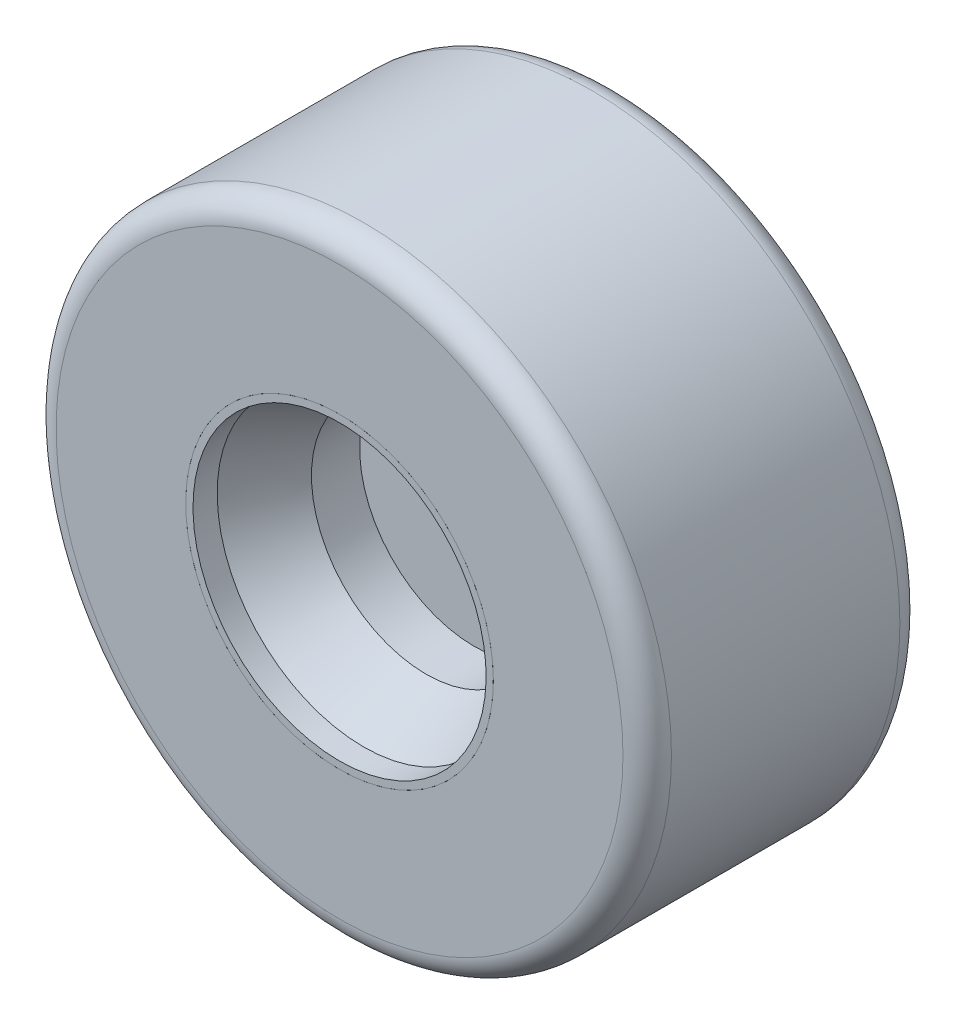
ISO-10303-21;
HEADER;
FILE_DESCRIPTION(('STEP AP214'),'2;1');
FILE_NAME('part.step','',(''),(''),'','','');
FILE_SCHEMA(('AUTOMOTIVE_DESIGN { 1 0 10303 214 1 1 1 1 }'));
ENDSEC;
DATA;
#1=APPLICATION_CONTEXT('core data for automotive mechanical design processes');
#2=APPLICATION_PROTOCOL_DEFINITION('international standard','automotive_design',2000,#1);
#3=PRODUCT_CONTEXT('',#1,'mechanical');
#4=PRODUCT('Part','Part','',(#3));
#5=PRODUCT_RELATED_PRODUCT_CATEGORY('part','',(#4));
#6=PRODUCT_DEFINITION_FORMATION('','',#4);
#7=PRODUCT_DEFINITION_CONTEXT('part definition',#1,'design');
#8=PRODUCT_DEFINITION('design','',#6,#7);
#9=PRODUCT_DEFINITION_SHAPE('','',#8);
#10=(LENGTH_UNIT() NAMED_UNIT(*) SI_UNIT(.MILLI.,.METRE.));
#11=(NAMED_UNIT(*) PLANE_ANGLE_UNIT() SI_UNIT($,.RADIAN.));
#12=(NAMED_UNIT(*) SI_UNIT($,.STERADIAN.) SOLID_ANGLE_UNIT());
#13=UNCERTAINTY_MEASURE_WITH_UNIT(LENGTH_MEASURE(1.E-05),#10,'distance_accuracy_value','');
#14=(GEOMETRIC_REPRESENTATION_CONTEXT(3) GLOBAL_UNCERTAINTY_ASSIGNED_CONTEXT((#13)) GLOBAL_UNIT_ASSIGNED_CONTEXT((#10,
#11,#12)) REPRESENTATION_CONTEXT('',''));
#15=CARTESIAN_POINT('',(0.,0.,0.));
#16=DIRECTION('',(0.,0.,1.));
#17=DIRECTION('',(1.,0.,0.));
#18=AXIS2_PLACEMENT_3D('',#15,#16,#17);
#19=CARTESIAN_POINT('',(0.,-45.7524474544663,-47.15));
#20=DIRECTION('',(0.,0.,1.));
#21=DIRECTION('',(1.,0.,0.));
#22=AXIS2_PLACEMENT_3D('',#19,#20,#21);
#23=TOROIDAL_SURFACE('',#22,117.,10.);
#24=CARTESIAN_POINT('',(0.,-45.7524474544663,-47.1499999999999));
#25=DIRECTION('',(0.,0.,1.));
#26=DIRECTION('',(1.,0.,0.));
#27=AXIS2_PLACEMENT_3D('',#24,#25,#26);
#28=CIRCLE('',#27,127.);
#29=CARTESIAN_POINT('',(127.,-45.7524474544663,-47.1499999999999));
#30=VERTEX_POINT('',#29);
#31=EDGE_CURVE('E12',#30,#30,#28,.T.);
#32=ORIENTED_EDGE('',*,*,#31,.F.);
#33=EDGE_LOOP('',(#32));
#34=FACE_BOUND('',#33,.T.);
#35=CARTESIAN_POINT('',(0.,-45.7524474544663,-57.1499999999999));
#36=DIRECTION('',(0.,0.,1.));
#37=DIRECTION('',(1.,0.,0.));
#38=AXIS2_PLACEMENT_3D('',#35,#36,#37);
#39=CIRCLE('',#38,117.);
#40=CARTESIAN_POINT('',(117.,-45.7524474544663,-57.1499999999999));
#41=VERTEX_POINT('',#40);
#42=EDGE_CURVE('E90',#41,#41,#39,.T.);
#43=ORIENTED_EDGE('',*,*,#42,.T.);
#44=EDGE_LOOP('',(#43));
#45=FACE_BOUND('',#44,.T.);
#46=ADVANCED_FACE('F55',(#34,#45),#23,.T.);
#47=CARTESIAN_POINT('',(0.,-45.7524474544663,166.091754176168));
#48=DIRECTION('',(0.,0.,1.));
#49=DIRECTION('',(1.,0.,0.));
#50=AXIS2_PLACEMENT_3D('',#47,#48,#49);
#51=CYLINDRICAL_SURFACE('',#50,127.);
#52=CARTESIAN_POINT('',(0.,-45.7524474544663,47.1499999999999));
#53=DIRECTION('',(0.,0.,1.));
#54=DIRECTION('',(1.,0.,0.));
#55=AXIS2_PLACEMENT_3D('',#52,#53,#54);
#56=CIRCLE('',#55,127.);
#57=CARTESIAN_POINT('',(127.,-45.7524474544663,47.1499999999999));
#58=VERTEX_POINT('',#57);
#59=EDGE_CURVE('E62',#58,#58,#56,.T.);
#60=ORIENTED_EDGE('',*,*,#59,.F.);
#61=EDGE_LOOP('',(#60));
#62=FACE_BOUND('',#61,.T.);
#63=ORIENTED_EDGE('',*,*,#31,.T.);
#64=EDGE_LOOP('',(#63));
#65=FACE_BOUND('',#64,.T.);
#66=ADVANCED_FACE('F180',(#62,#65),#51,.T.);
#67=CARTESIAN_POINT('',(0.,-45.7524474544663,47.15));
#68=DIRECTION('',(0.,0.,1.));
#69=DIRECTION('',(1.,0.,0.));
#70=AXIS2_PLACEMENT_3D('',#67,#68,#69);
#71=TOROIDAL_SURFACE('',#70,117.,9.99999999999999);
#72=CARTESIAN_POINT('',(0.,-45.7524474544663,57.15));
#73=DIRECTION('',(0.,0.,1.));
#74=DIRECTION('',(1.,0.,0.));
#75=AXIS2_PLACEMENT_3D('',#72,#73,#74);
#76=CIRCLE('',#75,117.);
#77=CARTESIAN_POINT('',(117.,-45.7524474544663,57.15));
#78=VERTEX_POINT('',#77);
#79=EDGE_CURVE('E66',#78,#78,#76,.T.);
#80=ORIENTED_EDGE('',*,*,#79,.F.);
#81=EDGE_LOOP('',(#80));
#82=FACE_BOUND('',#81,.T.);
#83=ORIENTED_EDGE('',*,*,#59,.T.);
#84=EDGE_LOOP('',(#83));
#85=FACE_BOUND('',#84,.T.);
#86=ADVANCED_FACE('F177',(#82,#85),#71,.T.);
#87=CARTESIAN_POINT('',(0.,17.7475525455337,57.15));
#88=DIRECTION('',(0.,0.,-1.));
#89=DIRECTION('',(-1.,0.,0.));
#90=AXIS2_PLACEMENT_3D('',#87,#88,#89);
#91=PLANE('',#90);
#92=CARTESIAN_POINT('',(0.,-45.7524474544663,57.15));
#93=DIRECTION('',(0.,0.,1.));
#94=DIRECTION('',(1.,0.,0.));
#95=AXIS2_PLACEMENT_3D('',#92,#93,#94);
#96=CIRCLE('',#95,63.5);
#97=CARTESIAN_POINT('',(63.5,-45.7524474544663,57.15));
#98=VERTEX_POINT('',#97);
#99=EDGE_CURVE('E70',#98,#98,#96,.T.);
#100=ORIENTED_EDGE('',*,*,#99,.F.);
#101=EDGE_LOOP('',(#100));
#102=FACE_BOUND('',#101,.T.);
#103=ORIENTED_EDGE('',*,*,#79,.T.);
#104=EDGE_LOOP('',(#103));
#105=FACE_BOUND('',#104,.T.);
#106=ADVANCED_FACE('F173',(#102,#105),#91,.F.);
#107=CARTESIAN_POINT('',(0.,-45.7524474544663,166.091754176168));
#108=DIRECTION('',(0.,0.,1.));
#109=DIRECTION('',(1.,0.,0.));
#110=AXIS2_PLACEMENT_3D('',#107,#108,#109);
#111=CYLINDRICAL_SURFACE('',#110,63.5);
#112=CARTESIAN_POINT('',(0.,-45.7524474544663,47.15));
#113=DIRECTION('',(0.,0.,1.));
#114=DIRECTION('',(1.,0.,0.));
#115=AXIS2_PLACEMENT_3D('',#112,#113,#114);
#116=CIRCLE('',#115,63.5);
#117=CARTESIAN_POINT('',(63.5,-45.7524474544663,47.15));
#118=VERTEX_POINT('',#117);
#119=EDGE_CURVE('E75',#118,#118,#116,.T.);
#120=ORIENTED_EDGE('',*,*,#119,.F.);
#121=EDGE_LOOP('',(#120));
#122=FACE_BOUND('',#121,.T.);
#123=ORIENTED_EDGE('',*,*,#99,.T.);
#124=EDGE_LOOP('',(#123));
#125=FACE_BOUND('',#124,.T.);
#126=ADVANCED_FACE('F169',(#122,#125),#111,.F.);
#127=CARTESIAN_POINT('',(0.,-45.7524474544663,47.15));
#128=DIRECTION('',(0.,0.,1.));
#129=DIRECTION('',(1.,0.,0.));
#130=AXIS2_PLACEMENT_3D('',#127,#128,#129);
#131=CONICAL_SURFACE('',#130,63.5,0.47123889803847);
#132=CARTESIAN_POINT('',(0.,-45.7524474544663,21.38));
#133=DIRECTION('',(0.,0.,1.));
#134=DIRECTION('',(1.,0.,0.));
#135=AXIS2_PLACEMENT_3D('',#132,#133,#134);
#136=CIRCLE('',#135,50.3695291665285);
#137=CARTESIAN_POINT('',(50.3695291665285,-45.7524474544663,21.38));
#138=VERTEX_POINT('',#137);
#139=EDGE_CURVE('E78',#138,#138,#136,.T.);
#140=ORIENTED_EDGE('',*,*,#139,.F.);
#141=EDGE_LOOP('',(#140));
#142=FACE_BOUND('',#141,.T.);
#143=ORIENTED_EDGE('',*,*,#119,.T.);
#144=EDGE_LOOP('',(#143));
#145=FACE_BOUND('',#144,.T.);
#146=ADVANCED_FACE('F165',(#142,#145),#131,.F.);
#147=CARTESIAN_POINT('',(0.,-45.7524474544663,166.091754176168));
#148=DIRECTION('',(0.,0.,1.));
#149=DIRECTION('',(1.,0.,0.));
#150=AXIS2_PLACEMENT_3D('',#147,#148,#149);
#151=CYLINDRICAL_SURFACE('',#150,50.3695291665285);
#152=CARTESIAN_POINT('',(0.,-45.7524474544663,-21.38));
#153=DIRECTION('',(0.,0.,1.));
#154=DIRECTION('',(1.,0.,0.));
#155=AXIS2_PLACEMENT_3D('',#152,#153,#154);
#156=CIRCLE('',#155,50.3695291665285);
#157=CARTESIAN_POINT('',(50.3695291665285,-45.7524474544663,-21.38));
#158=VERTEX_POINT('',#157);
#159=EDGE_CURVE('E81',#158,#158,#156,.T.);
#160=ORIENTED_EDGE('',*,*,#159,.F.);
#161=EDGE_LOOP('',(#160));
#162=FACE_BOUND('',#161,.T.);
#163=ORIENTED_EDGE('',*,*,#139,.T.);
#164=EDGE_LOOP('',(#163));
#165=FACE_BOUND('',#164,.T.);
#166=ADVANCED_FACE('F161',(#162,#165),#151,.F.);
#167=CARTESIAN_POINT('',(0.,-45.7524474544663,-21.38));
#168=DIRECTION('',(0.,0.,-1.));
#169=DIRECTION('',(-1.,0.,0.));
#170=AXIS2_PLACEMENT_3D('',#167,#168,#169);
#171=CONICAL_SURFACE('',#170,50.3695291665285,0.47123889803847);
#172=CARTESIAN_POINT('',(0.,-45.7524474544663,-47.15));
#173=DIRECTION('',(0.,0.,1.));
#174=DIRECTION('',(1.,0.,0.));
#175=AXIS2_PLACEMENT_3D('',#172,#173,#174);
#176=CIRCLE('',#175,63.5);
#177=CARTESIAN_POINT('',(63.5,-45.7524474544663,-47.15));
#178=VERTEX_POINT('',#177);
#179=EDGE_CURVE('E84',#178,#178,#176,.T.);
#180=ORIENTED_EDGE('',*,*,#179,.F.);
#181=EDGE_LOOP('',(#180));
#182=FACE_BOUND('',#181,.T.);
#183=ORIENTED_EDGE('',*,*,#159,.T.);
#184=EDGE_LOOP('',(#183));
#185=FACE_BOUND('',#184,.T.);
#186=ADVANCED_FACE('F157',(#182,#185),#171,.F.);
#187=CARTESIAN_POINT('',(0.,-45.7524474544663,166.091754176168));
#188=DIRECTION('',(0.,0.,1.));
#189=DIRECTION('',(1.,0.,0.));
#190=AXIS2_PLACEMENT_3D('',#187,#188,#189);
#191=CYLINDRICAL_SURFACE('',#190,63.5);
#192=CARTESIAN_POINT('',(0.,-45.7524474544663,-57.15));
#193=DIRECTION('',(0.,0.,1.));
#194=DIRECTION('',(1.,0.,0.));
#195=AXIS2_PLACEMENT_3D('',#192,#193,#194);
#196=CIRCLE('',#195,63.5);
#197=CARTESIAN_POINT('',(63.5,-45.7524474544663,-57.15));
#198=VERTEX_POINT('',#197);
#199=EDGE_CURVE('E87',#198,#198,#196,.T.);
#200=ORIENTED_EDGE('',*,*,#199,.F.);
#201=EDGE_LOOP('',(#200));
#202=FACE_BOUND('',#201,.T.);
#203=ORIENTED_EDGE('',*,*,#179,.T.);
#204=EDGE_LOOP('',(#203));
#205=FACE_BOUND('',#204,.T.);
#206=ADVANCED_FACE('F153',(#202,#205),#191,.F.);
#207=CARTESIAN_POINT('',(0.,17.7475525455337,-57.15));
#208=DIRECTION('',(0.,0.,1.));
#209=DIRECTION('',(1.,0.,0.));
#210=AXIS2_PLACEMENT_3D('',#207,#208,#209);
#211=PLANE('',#210);
#212=ORIENTED_EDGE('',*,*,#42,.F.);
#213=EDGE_LOOP('',(#212));
#214=FACE_BOUND('',#213,.T.);
#215=ORIENTED_EDGE('',*,*,#199,.T.);
#216=EDGE_LOOP('',(#215));
#217=FACE_BOUND('',#216,.T.);
#218=ADVANCED_FACE('F151',(#214,#217),#211,.F.);
#219=CLOSED_SHELL('',(#46,#66,#86,#106,#126,#146,#166,#186,#206,#218));
#220=CARTESIAN_POINT('',(0.,-45.7524474544663,166.091754176168));
#221=DIRECTION('',(0.,0.,1.));
#222=DIRECTION('',(1.,0.,0.));
#223=AXIS2_PLACEMENT_3D('',#220,#221,#222);
#224=CYLINDRICAL_SURFACE('',#223,72.3553337989361);
#225=CARTESIAN_POINT('',(0.,-45.7524474544663,-49.65));
#226=DIRECTION('',(0.,0.,1.));
#227=DIRECTION('',(1.,0.,0.));
#228=AXIS2_PLACEMENT_3D('',#225,#226,#227);
#229=CIRCLE('',#228,72.3553337989361);
#230=CARTESIAN_POINT('',(72.3553337989361,-45.7524474544663,-49.65));
#231=VERTEX_POINT('',#230);
#232=EDGE_CURVE('E120',#231,#231,#229,.T.);
#233=ORIENTED_EDGE('',*,*,#232,.T.);
#234=EDGE_LOOP('',(#233));
#235=FACE_BOUND('',#234,.T.);
#236=CARTESIAN_POINT('',(0.,-45.7524474544663,-45.35));
#237=DIRECTION('',(0.,0.,1.));
#238=DIRECTION('',(1.,0.,0.));
#239=AXIS2_PLACEMENT_3D('',#236,#237,#238);
#240=CIRCLE('',#239,72.3553337989361);
#241=CARTESIAN_POINT('',(72.3553337989361,-45.7524474544663,-45.35));
#242=VERTEX_POINT('',#241);
#243=EDGE_CURVE('E93',#242,#242,#240,.T.);
#244=ORIENTED_EDGE('',*,*,#243,.F.);
#245=EDGE_LOOP('',(#244));
#246=FACE_BOUND('',#245,.T.);
#247=ADVANCED_FACE('F124',(#235,#246),#224,.T.);
#248=CARTESIAN_POINT('',(0.,-45.7524474544663,-19.4637999155125));
#249=DIRECTION('',(0.,0.,-1.));
#250=DIRECTION('',(-1.,0.,0.));
#251=AXIS2_PLACEMENT_3D('',#248,#249,#250);
#252=CONICAL_SURFACE('',#251,59.4607207692294,0.462148019834914);
#253=ORIENTED_EDGE('',*,*,#243,.T.);
#254=EDGE_LOOP('',(#253));
#255=FACE_BOUND('',#254,.T.);
#256=CARTESIAN_POINT('',(0.,-45.7524474544663,-19.4637999155125));
#257=DIRECTION('',(0.,0.,1.));
#258=DIRECTION('',(1.,0.,0.));
#259=AXIS2_PLACEMENT_3D('',#256,#257,#258);
#260=CIRCLE('',#259,59.4607207692294);
#261=CARTESIAN_POINT('',(59.4607207692294,-45.7524474544663,-19.4637999155125));
#262=VERTEX_POINT('',#261);
#263=EDGE_CURVE('E96',#262,#262,#260,.T.);
#264=ORIENTED_EDGE('',*,*,#263,.F.);
#265=EDGE_LOOP('',(#264));
#266=FACE_BOUND('',#265,.T.);
#267=ADVANCED_FACE('F140',(#255,#266),#252,.T.);
#268=CARTESIAN_POINT('',(0.,-45.7524474544663,166.091754176168));
#269=DIRECTION('',(0.,0.,1.));
#270=DIRECTION('',(1.,0.,0.));
#271=AXIS2_PLACEMENT_3D('',#268,#269,#270);
#272=CYLINDRICAL_SURFACE('',#271,59.4607207692294);
#273=ORIENTED_EDGE('',*,*,#263,.T.);
#274=EDGE_LOOP('',(#273));
#275=FACE_BOUND('',#274,.T.);
#276=CARTESIAN_POINT('',(0.,-45.7524474544663,19.4637999155126));
#277=DIRECTION('',(0.,0.,1.));
#278=DIRECTION('',(1.,0.,0.));
#279=AXIS2_PLACEMENT_3D('',#276,#277,#278);
#280=CIRCLE('',#279,59.4607207692294);
#281=CARTESIAN_POINT('',(59.4607207692294,-45.7524474544663,19.4637999155126));
#282=VERTEX_POINT('',#281);
#283=EDGE_CURVE('E99',#282,#282,#280,.T.);
#284=ORIENTED_EDGE('',*,*,#283,.F.);
#285=EDGE_LOOP('',(#284));
#286=FACE_BOUND('',#285,.T.);
#287=ADVANCED_FACE('F146',(#275,#286),#272,.T.);
#288=CARTESIAN_POINT('',(0.,-45.7524474544663,45.35));
#289=DIRECTION('',(0.,0.,1.));
#290=DIRECTION('',(1.,0.,0.));
#291=AXIS2_PLACEMENT_3D('',#288,#289,#290);
#292=CONICAL_SURFACE('',#291,72.3553337989361,0.462148019834914);
#293=ORIENTED_EDGE('',*,*,#283,.T.);
#294=EDGE_LOOP('',(#293));
#295=FACE_BOUND('',#294,.T.);
#296=CARTESIAN_POINT('',(0.,-45.7524474544663,45.35));
#297=DIRECTION('',(0.,0.,1.));
#298=DIRECTION('',(1.,0.,0.));
#299=AXIS2_PLACEMENT_3D('',#296,#297,#298);
#300=CIRCLE('',#299,72.3553337989361);
#301=CARTESIAN_POINT('',(72.3553337989361,-45.7524474544663,45.35));
#302=VERTEX_POINT('',#301);
#303=EDGE_CURVE('E102',#302,#302,#300,.T.);
#304=ORIENTED_EDGE('',*,*,#303,.F.);
#305=EDGE_LOOP('',(#304));
#306=FACE_BOUND('',#305,.T.);
#307=ADVANCED_FACE('F279',(#295,#306),#292,.T.);
#308=CARTESIAN_POINT('',(0.,-45.7524474544663,166.091754176168));
#309=DIRECTION('',(0.,0.,1.));
#310=DIRECTION('',(1.,0.,0.));
#311=AXIS2_PLACEMENT_3D('',#308,#309,#310);
#312=CYLINDRICAL_SURFACE('',#311,72.3553337989361);
#313=ORIENTED_EDGE('',*,*,#303,.T.);
#314=EDGE_LOOP('',(#313));
#315=FACE_BOUND('',#314,.T.);
#316=CARTESIAN_POINT('',(0.,-45.7524474544663,49.65));
#317=DIRECTION('',(0.,0.,1.));
#318=DIRECTION('',(1.,0.,0.));
#319=AXIS2_PLACEMENT_3D('',#316,#317,#318);
#320=CIRCLE('',#319,72.3553337989361);
#321=CARTESIAN_POINT('',(72.3553337989361,-45.7524474544663,49.65));
#322=VERTEX_POINT('',#321);
#323=EDGE_CURVE('E105',#322,#322,#320,.T.);
#324=ORIENTED_EDGE('',*,*,#323,.F.);
#325=EDGE_LOOP('',(#324));
#326=FACE_BOUND('',#325,.T.);
#327=ADVANCED_FACE('F287',(#315,#326),#312,.T.);
#328=CARTESIAN_POINT('',(0.,26.6028863444698,49.65));
#329=DIRECTION('',(0.,0.,-1.));
#330=DIRECTION('',(-1.,0.,0.));
#331=AXIS2_PLACEMENT_3D('',#328,#329,#330);
#332=PLANE('',#331);
#333=ORIENTED_EDGE('',*,*,#323,.T.);
#334=EDGE_LOOP('',(#333));
#335=FACE_BOUND('',#334,.T.);
#336=CARTESIAN_POINT('',(0.,-45.7524474544663,49.65));
#337=DIRECTION('',(0.,0.,1.));
#338=DIRECTION('',(1.,0.,0.));
#339=AXIS2_PLACEMENT_3D('',#336,#337,#338);
#340=CIRCLE('',#339,118.355333798936);
#341=CARTESIAN_POINT('',(118.355333798936,-45.7524474544663,49.65));
#342=VERTEX_POINT('',#341);
#343=EDGE_CURVE('E108',#342,#342,#340,.T.);
#344=ORIENTED_EDGE('',*,*,#343,.F.);
#345=EDGE_LOOP('',(#344));
#346=FACE_BOUND('',#345,.T.);
#347=ADVANCED_FACE('F296',(#335,#346),#332,.T.);
#348=CARTESIAN_POINT('',(0.,-45.7524474544663,47.15));
#349=DIRECTION('',(0.,0.,1.));
#350=DIRECTION('',(1.,0.,0.));
#351=AXIS2_PLACEMENT_3D('',#348,#349,#350);
#352=TOROIDAL_SURFACE('',#351,118.355333798936,2.5);
#353=ORIENTED_EDGE('',*,*,#343,.T.);
#354=EDGE_LOOP('',(#353));
#355=FACE_BOUND('',#354,.T.);
#356=CARTESIAN_POINT('',(0.,-45.7524474544663,47.15));
#357=DIRECTION('',(0.,0.,1.));
#358=DIRECTION('',(1.,0.,0.));
#359=AXIS2_PLACEMENT_3D('',#356,#357,#358);
#360=CIRCLE('',#359,120.855333798936);
#361=CARTESIAN_POINT('',(120.855333798936,-45.7524474544663,47.15));
#362=VERTEX_POINT('',#361);
#363=EDGE_CURVE('E111',#362,#362,#360,.T.);
#364=ORIENTED_EDGE('',*,*,#363,.F.);
#365=EDGE_LOOP('',(#364));
#366=FACE_BOUND('',#365,.T.);
#367=ADVANCED_FACE('F305',(#355,#366),#352,.F.);
#368=CARTESIAN_POINT('',(0.,-45.7524474544663,166.091754176168));
#369=DIRECTION('',(0.,0.,1.));
#370=DIRECTION('',(1.,0.,0.));
#371=AXIS2_PLACEMENT_3D('',#368,#369,#370);
#372=CYLINDRICAL_SURFACE('',#371,120.855333798936);
#373=ORIENTED_EDGE('',*,*,#363,.T.);
#374=EDGE_LOOP('',(#373));
#375=FACE_BOUND('',#374,.T.);
#376=CARTESIAN_POINT('',(0.,-45.7524474544663,-47.15));
#377=DIRECTION('',(0.,0.,1.));
#378=DIRECTION('',(1.,0.,0.));
#379=AXIS2_PLACEMENT_3D('',#376,#377,#378);
#380=CIRCLE('',#379,120.855333798936);
#381=CARTESIAN_POINT('',(120.855333798936,-45.7524474544663,-47.15));
#382=VERTEX_POINT('',#381);
#383=EDGE_CURVE('E114',#382,#382,#380,.T.);
#384=ORIENTED_EDGE('',*,*,#383,.F.);
#385=EDGE_LOOP('',(#384));
#386=FACE_BOUND('',#385,.T.);
#387=ADVANCED_FACE('F136',(#375,#386),#372,.F.);
#388=CARTESIAN_POINT('',(0.,-45.7524474544663,-47.15));
#389=DIRECTION('',(0.,0.,1.));
#390=DIRECTION('',(1.,0.,0.));
#391=AXIS2_PLACEMENT_3D('',#388,#389,#390);
#392=TOROIDAL_SURFACE('',#391,118.355333798936,2.5);
#393=ORIENTED_EDGE('',*,*,#383,.T.);
#394=EDGE_LOOP('',(#393));
#395=FACE_BOUND('',#394,.T.);
#396=CARTESIAN_POINT('',(0.,-45.7524474544663,-49.65));
#397=DIRECTION('',(0.,0.,1.));
#398=DIRECTION('',(1.,0.,0.));
#399=AXIS2_PLACEMENT_3D('',#396,#397,#398);
#400=CIRCLE('',#399,118.355333798936);
#401=CARTESIAN_POINT('',(118.355333798936,-45.7524474544663,-49.65));
#402=VERTEX_POINT('',#401);
#403=EDGE_CURVE('E117',#402,#402,#400,.T.);
#404=ORIENTED_EDGE('',*,*,#403,.F.);
#405=EDGE_LOOP('',(#404));
#406=FACE_BOUND('',#405,.T.);
#407=ADVANCED_FACE('F129',(#395,#406),#392,.F.);
#408=CARTESIAN_POINT('',(0.,72.6028863444698,-49.65));
#409=DIRECTION('',(0.,0.,1.));
#410=DIRECTION('',(1.,0.,0.));
#411=AXIS2_PLACEMENT_3D('',#408,#409,#410);
#412=PLANE('',#411);
#413=ORIENTED_EDGE('',*,*,#403,.T.);
#414=EDGE_LOOP('',(#413));
#415=FACE_BOUND('',#414,.T.);
#416=ORIENTED_EDGE('',*,*,#232,.F.);
#417=EDGE_LOOP('',(#416));
#418=FACE_BOUND('',#417,.T.);
#419=ADVANCED_FACE('F127',(#415,#418),#412,.T.);
#420=CLOSED_SHELL('',(#247,#267,#287,#307,#327,#347,#367,#387,#407,#419));
#421=ORIENTED_CLOSED_SHELL('',*,#420,.T.);
#422=BREP_WITH_VOIDS('B2',#219,(#421));
#423=CARTESIAN_POINT('',(0.,-45.7524474544663,21.38));
#424=DIRECTION('',(0.,0.,1.));
#425=DIRECTION('',(0.,-1.,0.));
#426=AXIS2_PLACEMENT_3D('',#423,#424,#425);
#427=CONICAL_SURFACE('',#426,50.3695291665285,0.47123889803847);
#428=CARTESIAN_POINT('',(0.,-45.7524474544663,47.15));
#429=DIRECTION('',(0.,0.,1.));
#430=DIRECTION('',(0.,-1.,0.));
#431=AXIS2_PLACEMENT_3D('',#428,#429,#430);
#432=CIRCLE('',#431,63.5);
#433=CARTESIAN_POINT('',(0.,-109.252447454466,47.15));
#434=VERTEX_POINT('',#433);
#435=EDGE_CURVE('E53',#434,#434,#432,.T.);
#436=ORIENTED_EDGE('',*,*,#435,.F.);
#437=EDGE_LOOP('',(#436));
#438=FACE_BOUND('',#437,.T.);
#439=CARTESIAN_POINT('',(0.,-45.7524474544663,21.38));
#440=DIRECTION('',(0.,0.,1.));
#441=DIRECTION('',(0.,-1.,0.));
#442=AXIS2_PLACEMENT_3D('',#439,#440,#441);
#443=CIRCLE('',#442,50.3695291665285);
#444=CARTESIAN_POINT('',(0.,-96.1219766209948,21.38));
#445=VERTEX_POINT('',#444);
#446=EDGE_CURVE('E396',#445,#445,#443,.T.);
#447=ORIENTED_EDGE('',*,*,#446,.T.);
#448=EDGE_LOOP('',(#447));
#449=FACE_BOUND('',#448,.T.);
#450=ADVANCED_FACE('F369',(#438,#449),#427,.T.);
#451=CARTESIAN_POINT('',(0.,-45.7524474544663,57.4407306635856));
#452=DIRECTION('',(0.,0.,1.));
#453=DIRECTION('',(0.,-1.,0.));
#454=AXIS2_PLACEMENT_3D('',#451,#452,#453);
#455=CYLINDRICAL_SURFACE('',#454,63.5);
#456=CARTESIAN_POINT('',(0.,-45.7524474544663,57.15));
#457=DIRECTION('',(0.,0.,1.));
#458=DIRECTION('',(0.,-1.,0.));
#459=AXIS2_PLACEMENT_3D('',#456,#457,#458);
#460=CIRCLE('',#459,63.5);
#461=CARTESIAN_POINT('',(0.,-109.252447454466,57.15));
#462=VERTEX_POINT('',#461);
#463=EDGE_CURVE('E376',#462,#462,#460,.T.);
#464=ORIENTED_EDGE('',*,*,#463,.F.);
#465=EDGE_LOOP('',(#464));
#466=FACE_BOUND('',#465,.T.);
#467=ORIENTED_EDGE('',*,*,#435,.T.);
#468=EDGE_LOOP('',(#467));
#469=FACE_BOUND('',#468,.T.);
#470=ADVANCED_FACE('F450',(#466,#469),#455,.T.);
#471=CARTESIAN_POINT('',(0.,17.7475525455337,57.15));
#472=DIRECTION('',(0.,0.,-1.));
#473=DIRECTION('',(0.,1.,0.));
#474=AXIS2_PLACEMENT_3D('',#471,#472,#473);
#475=PLANE('',#474);
#476=CARTESIAN_POINT('',(0.,-45.7524474544663,57.15));
#477=DIRECTION('',(0.,0.,1.));
#478=DIRECTION('',(0.,-1.,0.));
#479=AXIS2_PLACEMENT_3D('',#476,#477,#478);
#480=CIRCLE('',#479,60.5);
#481=CARTESIAN_POINT('',(0.,-106.252447454466,57.15));
#482=VERTEX_POINT('',#481);
#483=EDGE_CURVE('E381',#482,#482,#480,.T.);
#484=ORIENTED_EDGE('',*,*,#483,.F.);
#485=EDGE_LOOP('',(#484));
#486=FACE_BOUND('',#485,.T.);
#487=ORIENTED_EDGE('',*,*,#463,.T.);
#488=EDGE_LOOP('',(#487));
#489=FACE_BOUND('',#488,.T.);
#490=ADVANCED_FACE('F447',(#486,#489),#475,.F.);
#491=CARTESIAN_POINT('',(0.,-45.7524474544663,57.4407306635856));
#492=DIRECTION('',(0.,0.,1.));
#493=DIRECTION('',(0.,-1.,0.));
#494=AXIS2_PLACEMENT_3D('',#491,#492,#493);
#495=CYLINDRICAL_SURFACE('',#494,60.5);
#496=CARTESIAN_POINT('',(0.,-45.7524474544663,47.15));
#497=DIRECTION('',(0.,0.,1.));
#498=DIRECTION('',(0.,-1.,0.));
#499=AXIS2_PLACEMENT_3D('',#496,#497,#498);
#500=CIRCLE('',#499,60.5);
#501=CARTESIAN_POINT('',(0.,-106.252447454466,47.15));
#502=VERTEX_POINT('',#501);
#503=EDGE_CURVE('E440',#502,#502,#500,.T.);
#504=ORIENTED_EDGE('',*,*,#503,.F.);
#505=EDGE_LOOP('',(#504));
#506=FACE_BOUND('',#505,.T.);
#507=ORIENTED_EDGE('',*,*,#483,.T.);
#508=EDGE_LOOP('',(#507));
#509=FACE_BOUND('',#508,.T.);
#510=ADVANCED_FACE('F445',(#506,#509),#495,.F.);
#511=CARTESIAN_POINT('',(0.,-45.7524474544663,47.15));
#512=DIRECTION('',(0.,0.,1.));
#513=DIRECTION('',(0.,-1.,0.));
#514=AXIS2_PLACEMENT_3D('',#511,#512,#513);
#515=CONICAL_SURFACE('',#514,60.5,0.47123889803847);
#516=CARTESIAN_POINT('',(0.,-45.7524474544663,21.38));
#517=DIRECTION('',(0.,0.,1.));
#518=DIRECTION('',(0.,-1.,0.));
#519=AXIS2_PLACEMENT_3D('',#516,#517,#518);
#520=CIRCLE('',#519,47.3695291665285);
#521=CARTESIAN_POINT('',(0.,-93.1219766209948,21.38));
#522=VERTEX_POINT('',#521);
#523=EDGE_CURVE('E437',#522,#522,#520,.T.);
#524=ORIENTED_EDGE('',*,*,#523,.F.);
#525=EDGE_LOOP('',(#524));
#526=FACE_BOUND('',#525,.T.);
#527=ORIENTED_EDGE('',*,*,#503,.T.);
#528=EDGE_LOOP('',(#527));
#529=FACE_BOUND('',#528,.T.);
#530=ADVANCED_FACE('F462',(#526,#529),#515,.F.);
#531=CARTESIAN_POINT('',(0.,-45.7524474544663,57.4407306635856));
#532=DIRECTION('',(0.,0.,1.));
#533=DIRECTION('',(0.,-1.,0.));
#534=AXIS2_PLACEMENT_3D('',#531,#532,#533);
#535=CYLINDRICAL_SURFACE('',#534,47.3695291665285);
#536=CARTESIAN_POINT('',(0.,-45.7524474544663,1.49999999999999));
#537=DIRECTION('',(0.,0.,1.));
#538=DIRECTION('',(0.,-1.,0.));
#539=AXIS2_PLACEMENT_3D('',#536,#537,#538);
#540=CIRCLE('',#539,47.3695291665285);
#541=CARTESIAN_POINT('',(0.,-93.1219766209948,1.49999999999998));
#542=VERTEX_POINT('',#541);
#543=EDGE_CURVE('E434',#542,#542,#540,.T.);
#544=ORIENTED_EDGE('',*,*,#543,.F.);
#545=EDGE_LOOP('',(#544));
#546=FACE_BOUND('',#545,.T.);
#547=ORIENTED_EDGE('',*,*,#523,.T.);
#548=EDGE_LOOP('',(#547));
#549=FACE_BOUND('',#548,.T.);
#550=ADVANCED_FACE('F466',(#546,#549),#535,.F.);
#551=CARTESIAN_POINT('',(0.,1.61708171206225,1.5));
#552=DIRECTION('',(0.,0.,-1.));
#553=DIRECTION('',(0.,1.,0.));
#554=AXIS2_PLACEMENT_3D('',#551,#552,#553);
#555=PLANE('',#554);
#556=CARTESIAN_POINT('',(0.,-25.7524474544663,1.5));
#557=DIRECTION('',(0.,0.,1.));
#558=DIRECTION('',(1.,0.,0.));
#559=AXIS2_PLACEMENT_3D('',#556,#557,#558);
#560=CIRCLE('',#559,4.);
#561=CARTESIAN_POINT('',(4.,-25.7524474544663,1.5));
#562=VERTEX_POINT('',#561);
#563=EDGE_CURVE('E389',#562,#562,#560,.T.);
#564=ORIENTED_EDGE('',*,*,#563,.F.);
#565=EDGE_LOOP('',(#564));
#566=FACE_BOUND('',#565,.T.);
#567=CARTESIAN_POINT('',(-20.,-45.7524474544663,1.5));
#568=DIRECTION('',(0.,0.,1.));
#569=DIRECTION('',(1.,0.,0.));
#570=AXIS2_PLACEMENT_3D('',#567,#568,#569);
#571=CIRCLE('',#570,4.);
#572=CARTESIAN_POINT('',(-16.,-45.7524474544663,1.5));
#573=VERTEX_POINT('',#572);
#574=EDGE_CURVE('E530',#573,#573,#571,.T.);
#575=ORIENTED_EDGE('',*,*,#574,.F.);
#576=EDGE_LOOP('',(#575));
#577=FACE_BOUND('',#576,.T.);
#578=CARTESIAN_POINT('',(20.,-45.7524474544663,1.5));
#579=DIRECTION('',(0.,0.,1.));
#580=DIRECTION('',(1.,0.,0.));
#581=AXIS2_PLACEMENT_3D('',#578,#579,#580);
#582=CIRCLE('',#581,4.);
#583=CARTESIAN_POINT('',(24.,-45.7524474544663,1.5));
#584=VERTEX_POINT('',#583);
#585=EDGE_CURVE('E533',#584,#584,#582,.T.);
#586=ORIENTED_EDGE('',*,*,#585,.F.);
#587=EDGE_LOOP('',(#586));
#588=FACE_BOUND('',#587,.T.);
#589=CARTESIAN_POINT('',(0.,-65.7524474544663,1.5));
#590=DIRECTION('',(0.,0.,1.));
#591=DIRECTION('',(1.,0.,0.));
#592=AXIS2_PLACEMENT_3D('',#589,#590,#591);
#593=CIRCLE('',#592,4.);
#594=CARTESIAN_POINT('',(4.,-65.7524474544663,1.5));
#595=VERTEX_POINT('',#594);
#596=EDGE_CURVE('E408',#595,#595,#593,.T.);
#597=ORIENTED_EDGE('',*,*,#596,.F.);
#598=EDGE_LOOP('',(#597));
#599=FACE_BOUND('',#598,.T.);
#600=CARTESIAN_POINT('',(0.,-45.7524474544663,1.49999999999999));
#601=DIRECTION('',(0.,0.,1.));
#602=DIRECTION('',(0.,-1.,0.));
#603=AXIS2_PLACEMENT_3D('',#600,#601,#602);
#604=CIRCLE('',#603,9.99999999999998);
#605=CARTESIAN_POINT('',(0.,-55.7524474544663,1.49999999999999));
#606=VERTEX_POINT('',#605);
#607=EDGE_CURVE('E431',#606,#606,#604,.T.);
#608=ORIENTED_EDGE('',*,*,#607,.F.);
#609=EDGE_LOOP('',(#608));
#610=FACE_BOUND('',#609,.T.);
#611=ORIENTED_EDGE('',*,*,#543,.T.);
#612=EDGE_LOOP('',(#611));
#613=FACE_BOUND('',#612,.T.);
#614=ADVANCED_FACE('F470',(#566,#577,#588,#599,#610,#613),#555,.F.);
#615=CARTESIAN_POINT('',(0.,-45.7524474544663,57.4407306635856));
#616=DIRECTION('',(0.,0.,1.));
#617=DIRECTION('',(0.,-1.,0.));
#618=AXIS2_PLACEMENT_3D('',#615,#616,#617);
#619=CYLINDRICAL_SURFACE('',#618,9.99999999999998);
#620=CARTESIAN_POINT('',(0.,-45.7524474544663,-1.50000000000001));
#621=DIRECTION('',(0.,0.,1.));
#622=DIRECTION('',(0.,-1.,0.));
#623=AXIS2_PLACEMENT_3D('',#620,#621,#622);
#624=CIRCLE('',#623,9.99999999999998);
#625=CARTESIAN_POINT('',(0.,-55.7524474544662,-1.50000000000001));
#626=VERTEX_POINT('',#625);
#627=EDGE_CURVE('E428',#626,#626,#624,.T.);
#628=ORIENTED_EDGE('',*,*,#627,.F.);
#629=EDGE_LOOP('',(#628));
#630=FACE_BOUND('',#629,.T.);
#631=ORIENTED_EDGE('',*,*,#607,.T.);
#632=EDGE_LOOP('',(#631));
#633=FACE_BOUND('',#632,.T.);
#634=ADVANCED_FACE('F474',(#630,#633),#619,.F.);
#635=CARTESIAN_POINT('',(0.,1.61708171206225,-1.49999999999999));
#636=DIRECTION('',(0.,0.,1.));
#637=DIRECTION('',(0.,-1.,0.));
#638=AXIS2_PLACEMENT_3D('',#635,#636,#637);
#639=PLANE('',#638);
#640=CARTESIAN_POINT('',(0.,-25.7524474544663,-1.49999999999999));
#641=DIRECTION('',(0.,0.,1.));
#642=DIRECTION('',(0.,-1.,0.));
#643=AXIS2_PLACEMENT_3D('',#640,#641,#642);
#644=CIRCLE('',#643,4.);
#645=CARTESIAN_POINT('',(0.,-29.7524474544663,-1.49999999999999));
#646=VERTEX_POINT('',#645);
#647=EDGE_CURVE('E372',#646,#646,#644,.T.);
#648=ORIENTED_EDGE('',*,*,#647,.T.);
#649=EDGE_LOOP('',(#648));
#650=FACE_BOUND('',#649,.T.);
#651=CARTESIAN_POINT('',(-20.,-45.7524474544663,-1.49999999999999));
#652=DIRECTION('',(0.,0.,1.));
#653=DIRECTION('',(0.,-1.,0.));
#654=AXIS2_PLACEMENT_3D('',#651,#652,#653);
#655=CIRCLE('',#654,4.);
#656=CARTESIAN_POINT('',(-20.,-49.7524474544663,-1.5));
#657=VERTEX_POINT('',#656);
#658=EDGE_CURVE('E391',#657,#657,#655,.T.);
#659=ORIENTED_EDGE('',*,*,#658,.T.);
#660=EDGE_LOOP('',(#659));
#661=FACE_BOUND('',#660,.T.);
#662=CARTESIAN_POINT('',(20.,-45.7524474544663,-1.49999999999999));
#663=DIRECTION('',(0.,0.,1.));
#664=DIRECTION('',(0.,-1.,0.));
#665=AXIS2_PLACEMENT_3D('',#662,#663,#664);
#666=CIRCLE('',#665,4.);
#667=CARTESIAN_POINT('',(20.,-49.7524474544663,-1.5));
#668=VERTEX_POINT('',#667);
#669=EDGE_CURVE('E388',#668,#668,#666,.T.);
#670=ORIENTED_EDGE('',*,*,#669,.T.);
#671=EDGE_LOOP('',(#670));
#672=FACE_BOUND('',#671,.T.);
#673=CARTESIAN_POINT('',(0.,-65.7524474544663,-1.5));
#674=DIRECTION('',(0.,0.,1.));
#675=DIRECTION('',(0.,-1.,0.));
#676=AXIS2_PLACEMENT_3D('',#673,#674,#675);
#677=CIRCLE('',#676,4.);
#678=CARTESIAN_POINT('',(0.,-69.7524474544663,-1.5));
#679=VERTEX_POINT('',#678);
#680=EDGE_CURVE('E385',#679,#679,#677,.T.);
#681=ORIENTED_EDGE('',*,*,#680,.T.);
#682=EDGE_LOOP('',(#681));
#683=FACE_BOUND('',#682,.T.);
#684=CARTESIAN_POINT('',(0.,-45.7524474544663,-1.49999999999997));
#685=DIRECTION('',(0.,0.,1.));
#686=DIRECTION('',(0.,-1.,0.));
#687=AXIS2_PLACEMENT_3D('',#684,#685,#686);
#688=CIRCLE('',#687,47.3695291665285);
#689=CARTESIAN_POINT('',(0.,-93.1219766209948,-1.49999999999998));
#690=VERTEX_POINT('',#689);
#691=EDGE_CURVE('E425',#690,#690,#688,.T.);
#692=ORIENTED_EDGE('',*,*,#691,.F.);
#693=EDGE_LOOP('',(#692));
#694=FACE_BOUND('',#693,.T.);
#695=ORIENTED_EDGE('',*,*,#627,.T.);
#696=EDGE_LOOP('',(#695));
#697=FACE_BOUND('',#696,.T.);
#698=ADVANCED_FACE('F478',(#650,#661,#672,#683,#694,#697),#639,.F.);
#699=CARTESIAN_POINT('',(0.,-45.7524474544663,57.4407306635856));
#700=DIRECTION('',(0.,0.,1.));
#701=DIRECTION('',(0.,-1.,0.));
#702=AXIS2_PLACEMENT_3D('',#699,#700,#701);
#703=CYLINDRICAL_SURFACE('',#702,47.3695291665285);
#704=CARTESIAN_POINT('',(0.,-45.7524474544663,-21.38));
#705=DIRECTION('',(0.,0.,1.));
#706=DIRECTION('',(0.,-1.,0.));
#707=AXIS2_PLACEMENT_3D('',#704,#705,#706);
#708=CIRCLE('',#707,47.3695291665285);
#709=CARTESIAN_POINT('',(0.,-93.1219766209948,-21.38));
#710=VERTEX_POINT('',#709);
#711=EDGE_CURVE('E422',#710,#710,#708,.T.);
#712=ORIENTED_EDGE('',*,*,#711,.F.);
#713=EDGE_LOOP('',(#712));
#714=FACE_BOUND('',#713,.T.);
#715=ORIENTED_EDGE('',*,*,#691,.T.);
#716=EDGE_LOOP('',(#715));
#717=FACE_BOUND('',#716,.T.);
#718=ADVANCED_FACE('F482',(#714,#717),#703,.F.);
#719=CARTESIAN_POINT('',(0.,-45.7524474544663,-21.38));
#720=DIRECTION('',(0.,0.,-1.));
#721=DIRECTION('',(0.,1.,0.));
#722=AXIS2_PLACEMENT_3D('',#719,#720,#721);
#723=CONICAL_SURFACE('',#722,47.3695291665285,0.47123889803847);
#724=CARTESIAN_POINT('',(0.,-45.7524474544663,-47.15));
#725=DIRECTION('',(0.,0.,1.));
#726=DIRECTION('',(0.,-1.,0.));
#727=AXIS2_PLACEMENT_3D('',#724,#725,#726);
#728=CIRCLE('',#727,60.5);
#729=CARTESIAN_POINT('',(0.,-106.252447454466,-47.15));
#730=VERTEX_POINT('',#729);
#731=EDGE_CURVE('E419',#730,#730,#728,.T.);
#732=ORIENTED_EDGE('',*,*,#731,.F.);
#733=EDGE_LOOP('',(#732));
#734=FACE_BOUND('',#733,.T.);
#735=ORIENTED_EDGE('',*,*,#711,.T.);
#736=EDGE_LOOP('',(#735));
#737=FACE_BOUND('',#736,.T.);
#738=ADVANCED_FACE('F485',(#734,#737),#723,.F.);
#739=CARTESIAN_POINT('',(0.,-45.7524474544663,57.4407306635856));
#740=DIRECTION('',(0.,0.,1.));
#741=DIRECTION('',(0.,-1.,0.));
#742=AXIS2_PLACEMENT_3D('',#739,#740,#741);
#743=CYLINDRICAL_SURFACE('',#742,60.5);
#744=CARTESIAN_POINT('',(0.,-45.7524474544663,-57.15));
#745=DIRECTION('',(0.,0.,1.));
#746=DIRECTION('',(0.,-1.,0.));
#747=AXIS2_PLACEMENT_3D('',#744,#745,#746);
#748=CIRCLE('',#747,60.5);
#749=CARTESIAN_POINT('',(0.,-106.252447454466,-57.15));
#750=VERTEX_POINT('',#749);
#751=EDGE_CURVE('E416',#750,#750,#748,.T.);
#752=ORIENTED_EDGE('',*,*,#751,.F.);
#753=EDGE_LOOP('',(#752));
#754=FACE_BOUND('',#753,.T.);
#755=ORIENTED_EDGE('',*,*,#731,.T.);
#756=EDGE_LOOP('',(#755));
#757=FACE_BOUND('',#756,.T.);
#758=ADVANCED_FACE('F489',(#754,#757),#743,.F.);
#759=CARTESIAN_POINT('',(0.,17.7475525455338,-57.15));
#760=DIRECTION('',(0.,0.,1.));
#761=DIRECTION('',(0.,-1.,0.));
#762=AXIS2_PLACEMENT_3D('',#759,#760,#761);
#763=PLANE('',#762);
#764=CARTESIAN_POINT('',(0.,-45.7524474544663,-57.15));
#765=DIRECTION('',(0.,0.,1.));
#766=DIRECTION('',(0.,-1.,0.));
#767=AXIS2_PLACEMENT_3D('',#764,#765,#766);
#768=CIRCLE('',#767,63.5);
#769=CARTESIAN_POINT('',(0.,-109.252447454466,-57.15));
#770=VERTEX_POINT('',#769);
#771=EDGE_CURVE('E413',#770,#770,#768,.T.);
#772=ORIENTED_EDGE('',*,*,#771,.F.);
#773=EDGE_LOOP('',(#772));
#774=FACE_BOUND('',#773,.T.);
#775=ORIENTED_EDGE('',*,*,#751,.T.);
#776=EDGE_LOOP('',(#775));
#777=FACE_BOUND('',#776,.T.);
#778=ADVANCED_FACE('F493',(#774,#777),#763,.F.);
#779=CARTESIAN_POINT('',(0.,-45.7524474544663,57.4407306635856));
#780=DIRECTION('',(0.,0.,1.));
#781=DIRECTION('',(0.,-1.,0.));
#782=AXIS2_PLACEMENT_3D('',#779,#780,#781);
#783=CYLINDRICAL_SURFACE('',#782,63.5);
#784=CARTESIAN_POINT('',(0.,-45.7524474544663,-47.15));
#785=DIRECTION('',(0.,0.,1.));
#786=DIRECTION('',(0.,-1.,0.));
#787=AXIS2_PLACEMENT_3D('',#784,#785,#786);
#788=CIRCLE('',#787,63.5);
#789=CARTESIAN_POINT('',(0.,-109.252447454466,-47.15));
#790=VERTEX_POINT('',#789);
#791=EDGE_CURVE('E405',#790,#790,#788,.T.);
#792=ORIENTED_EDGE('',*,*,#791,.F.);
#793=EDGE_LOOP('',(#792));
#794=FACE_BOUND('',#793,.T.);
#795=ORIENTED_EDGE('',*,*,#771,.T.);
#796=EDGE_LOOP('',(#795));
#797=FACE_BOUND('',#796,.T.);
#798=ADVANCED_FACE('F497',(#794,#797),#783,.T.);
#799=CARTESIAN_POINT('',(0.,-45.7524474544663,-47.15));
#800=DIRECTION('',(0.,0.,-1.));
#801=DIRECTION('',(0.,1.,0.));
#802=AXIS2_PLACEMENT_3D('',#799,#800,#801);
#803=CONICAL_SURFACE('',#802,63.5,0.47123889803847);
#804=CARTESIAN_POINT('',(0.,-45.7524474544663,-21.38));
#805=DIRECTION('',(0.,0.,1.));
#806=DIRECTION('',(0.,-1.,0.));
#807=AXIS2_PLACEMENT_3D('',#804,#805,#806);
#808=CIRCLE('',#807,50.3695291665285);
#809=CARTESIAN_POINT('',(0.,-96.1219766209948,-21.38));
#810=VERTEX_POINT('',#809);
#811=EDGE_CURVE('E400',#810,#810,#808,.T.);
#812=ORIENTED_EDGE('',*,*,#811,.F.);
#813=EDGE_LOOP('',(#812));
#814=FACE_BOUND('',#813,.T.);
#815=ORIENTED_EDGE('',*,*,#791,.T.);
#816=EDGE_LOOP('',(#815));
#817=FACE_BOUND('',#816,.T.);
#818=ADVANCED_FACE('F501',(#814,#817),#803,.T.);
#819=CARTESIAN_POINT('',(0.,-45.7524474544663,57.4407306635856));
#820=DIRECTION('',(0.,0.,1.));
#821=DIRECTION('',(0.,-1.,0.));
#822=AXIS2_PLACEMENT_3D('',#819,#820,#821);
#823=CYLINDRICAL_SURFACE('',#822,50.3695291665285);
#824=ORIENTED_EDGE('',*,*,#446,.F.);
#825=EDGE_LOOP('',(#824));
#826=FACE_BOUND('',#825,.T.);
#827=ORIENTED_EDGE('',*,*,#811,.T.);
#828=EDGE_LOOP('',(#827));
#829=FACE_BOUND('',#828,.T.);
#830=ADVANCED_FACE('F505',(#826,#829),#823,.T.);
#831=CARTESIAN_POINT('',(0.,-65.7524474544663,-8.5));
#832=DIRECTION('',(0.,0.,1.));
#833=DIRECTION('',(1.,0.,0.));
#834=AXIS2_PLACEMENT_3D('',#831,#832,#833);
#835=CYLINDRICAL_SURFACE('',#834,4.);
#836=ORIENTED_EDGE('',*,*,#596,.T.);
#837=EDGE_LOOP('',(#836));
#838=FACE_BOUND('',#837,.T.);
#839=ORIENTED_EDGE('',*,*,#680,.F.);
#840=EDGE_LOOP('',(#839));
#841=FACE_BOUND('',#840,.T.);
#842=ADVANCED_FACE('F509',(#838,#841),#835,.F.);
#843=CARTESIAN_POINT('',(20.,-45.7524474544663,-8.5));
#844=DIRECTION('',(0.,0.,1.));
#845=DIRECTION('',(1.,0.,0.));
#846=AXIS2_PLACEMENT_3D('',#843,#844,#845);
#847=CYLINDRICAL_SURFACE('',#846,4.);
#848=ORIENTED_EDGE('',*,*,#585,.T.);
#849=EDGE_LOOP('',(#848));
#850=FACE_BOUND('',#849,.T.);
#851=ORIENTED_EDGE('',*,*,#669,.F.);
#852=EDGE_LOOP('',(#851));
#853=FACE_BOUND('',#852,.T.);
#854=ADVANCED_FACE('F513',(#850,#853),#847,.F.);
#855=CARTESIAN_POINT('',(-20.,-45.7524474544663,-8.5));
#856=DIRECTION('',(0.,0.,1.));
#857=DIRECTION('',(1.,0.,0.));
#858=AXIS2_PLACEMENT_3D('',#855,#856,#857);
#859=CYLINDRICAL_SURFACE('',#858,4.);
#860=ORIENTED_EDGE('',*,*,#574,.T.);
#861=EDGE_LOOP('',(#860));
#862=FACE_BOUND('',#861,.T.);
#863=ORIENTED_EDGE('',*,*,#658,.F.);
#864=EDGE_LOOP('',(#863));
#865=FACE_BOUND('',#864,.T.);
#866=ADVANCED_FACE('F517',(#862,#865),#859,.F.);
#867=CARTESIAN_POINT('',(0.,-25.7524474544663,-8.5));
#868=DIRECTION('',(0.,0.,1.));
#869=DIRECTION('',(1.,0.,0.));
#870=AXIS2_PLACEMENT_3D('',#867,#868,#869);
#871=CYLINDRICAL_SURFACE('',#870,4.);
#872=ORIENTED_EDGE('',*,*,#563,.T.);
#873=EDGE_LOOP('',(#872));
#874=FACE_BOUND('',#873,.T.);
#875=ORIENTED_EDGE('',*,*,#647,.F.);
#876=EDGE_LOOP('',(#875));
#877=FACE_BOUND('',#876,.T.);
#878=ADVANCED_FACE('F521',(#874,#877),#871,.F.);
#879=CLOSED_SHELL('',(#450,#470,#490,#510,#530,#550,#614,#634,#698,#718,#738,#758,#778,#798,
#818,#830,#842,#854,#866,#878));
#880=MANIFOLD_SOLID_BREP('B7',#879);
#881=ADVANCED_BREP_SHAPE_REPRESENTATION('',(#18,#422,#880),#14);
#882=SHAPE_DEFINITION_REPRESENTATION(#9,#881);
ENDSEC;
END-ISO-10303-21;
